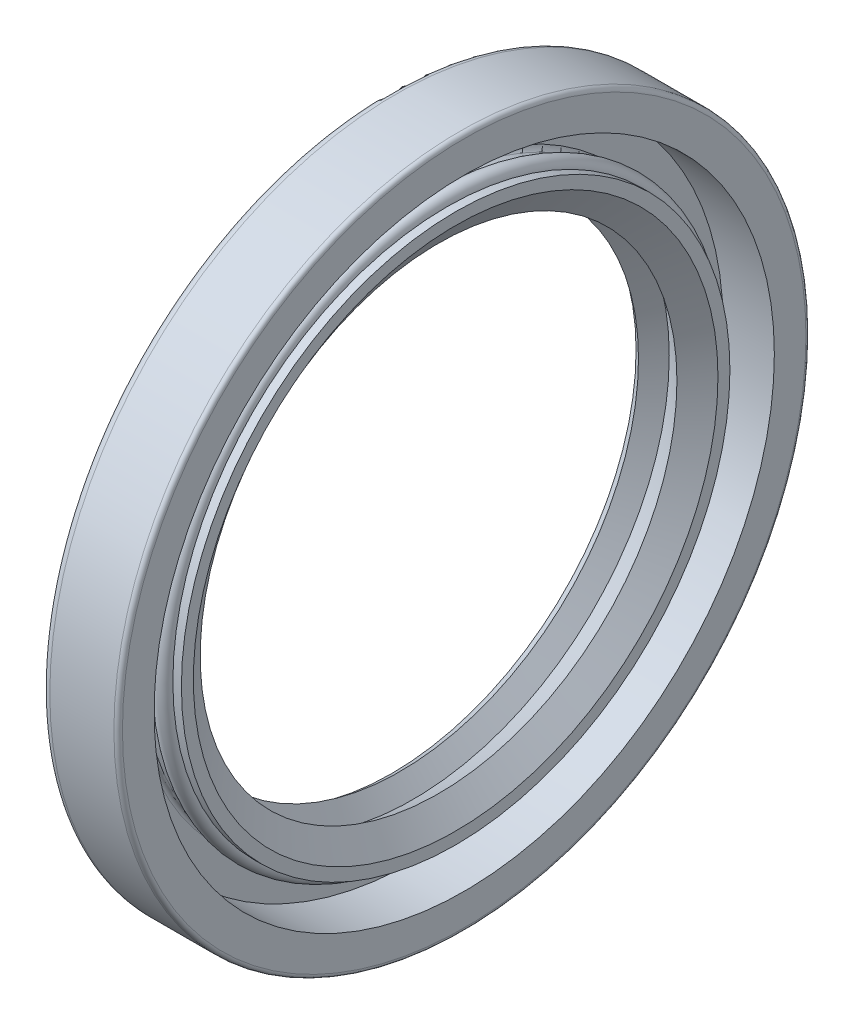
ISO-10303-21;
HEADER;
FILE_DESCRIPTION(('STEP AP214'),'2;1');
FILE_NAME('part.step','',(''),(''),'','','');
FILE_SCHEMA(('AUTOMOTIVE_DESIGN { 1 0 10303 214 1 1 1 1 }'));
ENDSEC;
DATA;
#1=APPLICATION_CONTEXT('core data for automotive mechanical design processes');
#2=APPLICATION_PROTOCOL_DEFINITION('international standard','automotive_design',2000,#1);
#3=PRODUCT_CONTEXT('',#1,'mechanical');
#4=PRODUCT('Part','Part','',(#3));
#5=PRODUCT_RELATED_PRODUCT_CATEGORY('part','',(#4));
#6=PRODUCT_DEFINITION_FORMATION('','',#4);
#7=PRODUCT_DEFINITION_CONTEXT('part definition',#1,'design');
#8=PRODUCT_DEFINITION('design','',#6,#7);
#9=PRODUCT_DEFINITION_SHAPE('','',#8);
#10=(LENGTH_UNIT() NAMED_UNIT(*) SI_UNIT(.MILLI.,.METRE.));
#11=(NAMED_UNIT(*) PLANE_ANGLE_UNIT() SI_UNIT($,.RADIAN.));
#12=(NAMED_UNIT(*) SI_UNIT($,.STERADIAN.) SOLID_ANGLE_UNIT());
#13=UNCERTAINTY_MEASURE_WITH_UNIT(LENGTH_MEASURE(1.E-05),#10,'distance_accuracy_value','');
#14=(GEOMETRIC_REPRESENTATION_CONTEXT(3) GLOBAL_UNCERTAINTY_ASSIGNED_CONTEXT((#13)) GLOBAL_UNIT_ASSIGNED_CONTEXT((#10,
#11,#12)) REPRESENTATION_CONTEXT('',''));
#15=CARTESIAN_POINT('',(0.,0.,0.));
#16=DIRECTION('',(0.,0.,1.));
#17=DIRECTION('',(1.,0.,0.));
#18=AXIS2_PLACEMENT_3D('',#15,#16,#17);
#19=CARTESIAN_POINT('',(0.,43.888888888889,0.));
#20=DIRECTION('',(-1.,0.,0.));
#21=DIRECTION('',(0.,0.,1.));
#22=AXIS2_PLACEMENT_3D('',#19,#20,#21);
#23=PLANE('',#22);
#24=CARTESIAN_POINT('',(0.,0.,0.));
#25=DIRECTION('',(1.,0.,0.));
#26=DIRECTION('',(0.,0.,-1.));
#27=AXIS2_PLACEMENT_3D('',#24,#25,#26);
#28=CIRCLE('',#27,40.333333333333);
#29=CARTESIAN_POINT('',(0.,0.,-40.333333333333));
#30=VERTEX_POINT('',#29);
#31=EDGE_CURVE('E119',#30,#30,#28,.T.);
#32=ORIENTED_EDGE('',*,*,#31,.T.);
#33=EDGE_LOOP('',(#32));
#34=FACE_BOUND('',#33,.T.);
#35=CARTESIAN_POINT('',(0.,0.,0.));
#36=DIRECTION('',(1.,0.,0.));
#37=DIRECTION('',(0.,0.,-1.));
#38=AXIS2_PLACEMENT_3D('',#35,#36,#37);
#39=CIRCLE('',#38,43.8888888888884);
#40=CARTESIAN_POINT('',(0.,0.,-43.8888888888884));
#41=VERTEX_POINT('',#40);
#42=EDGE_CURVE('E115',#41,#41,#39,.T.);
#43=ORIENTED_EDGE('',*,*,#42,.F.);
#44=EDGE_LOOP('',(#43));
#45=FACE_BOUND('',#44,.T.);
#46=ADVANCED_FACE('F24',(#34,#45),#23,.T.);
#47=CARTESIAN_POINT('',(10.,0.,0.));
#48=DIRECTION('',(1.,0.,0.));
#49=DIRECTION('',(0.,0.,-1.));
#50=AXIS2_PLACEMENT_3D('',#47,#48,#49);
#51=CYLINDRICAL_SURFACE('',#50,40.333333333333);
#52=CARTESIAN_POINT('',(0.199999999999999,0.,0.));
#53=DIRECTION('',(1.,0.,0.));
#54=DIRECTION('',(0.,0.,-1.));
#55=AXIS2_PLACEMENT_3D('',#52,#53,#54);
#56=CIRCLE('',#55,40.333333333333);
#57=CARTESIAN_POINT('',(0.199999999999999,0.,-40.333333333333));
#58=VERTEX_POINT('',#57);
#59=EDGE_CURVE('E111',#58,#58,#56,.T.);
#60=ORIENTED_EDGE('',*,*,#59,.T.);
#61=EDGE_LOOP('',(#60));
#62=FACE_BOUND('',#61,.T.);
#63=ORIENTED_EDGE('',*,*,#31,.F.);
#64=EDGE_LOOP('',(#63));
#65=FACE_BOUND('',#64,.T.);
#66=ADVANCED_FACE('F127',(#62,#65),#51,.F.);
#67=CARTESIAN_POINT('',(1.11111111111158,0.,0.));
#68=DIRECTION('',(1.,0.,0.));
#69=DIRECTION('',(0.,0.,-1.));
#70=AXIS2_PLACEMENT_3D('',#67,#68,#69);
#71=TOROIDAL_SURFACE('',#70,43.8888888888884,1.11111111111158);
#72=ORIENTED_EDGE('',*,*,#42,.T.);
#73=EDGE_LOOP('',(#72));
#74=FACE_BOUND('',#73,.T.);
#75=CARTESIAN_POINT('',(1.1111111111111,0.,0.));
#76=DIRECTION('',(1.,0.,0.));
#77=DIRECTION('',(0.,0.,-1.));
#78=AXIS2_PLACEMENT_3D('',#75,#76,#77);
#79=CIRCLE('',#78,45.);
#80=CARTESIAN_POINT('',(1.1111111111111,0.,-45.));
#81=VERTEX_POINT('',#80);
#82=EDGE_CURVE('E107',#81,#81,#79,.T.);
#83=ORIENTED_EDGE('',*,*,#82,.F.);
#84=EDGE_LOOP('',(#83));
#85=FACE_BOUND('',#84,.T.);
#86=ADVANCED_FACE('F129',(#74,#85),#71,.T.);
#87=CARTESIAN_POINT('',(0.2,40.333333333333,0.));
#88=DIRECTION('',(-1.,0.,0.));
#89=DIRECTION('',(0.,0.,1.));
#90=AXIS2_PLACEMENT_3D('',#87,#88,#89);
#91=PLANE('',#90);
#92=CARTESIAN_POINT('',(0.199999999999999,0.,0.));
#93=DIRECTION('',(1.,0.,0.));
#94=DIRECTION('',(0.,0.,-1.));
#95=AXIS2_PLACEMENT_3D('',#92,#93,#94);
#96=CIRCLE('',#95,35.666666666667);
#97=CARTESIAN_POINT('',(0.199999999999999,0.,-35.666666666667));
#98=VERTEX_POINT('',#97);
#99=EDGE_CURVE('E103',#98,#98,#96,.T.);
#100=ORIENTED_EDGE('',*,*,#99,.T.);
#101=EDGE_LOOP('',(#100));
#102=FACE_BOUND('',#101,.T.);
#103=ORIENTED_EDGE('',*,*,#59,.F.);
#104=EDGE_LOOP('',(#103));
#105=FACE_BOUND('',#104,.T.);
#106=ADVANCED_FACE('F137',(#102,#105),#91,.T.);
#107=CARTESIAN_POINT('',(10.,0.,0.));
#108=DIRECTION('',(1.,0.,0.));
#109=DIRECTION('',(0.,0.,-1.));
#110=AXIS2_PLACEMENT_3D('',#107,#108,#109);
#111=CYLINDRICAL_SURFACE('',#110,45.);
#112=ORIENTED_EDGE('',*,*,#82,.T.);
#113=EDGE_LOOP('',(#112));
#114=FACE_BOUND('',#113,.T.);
#115=CARTESIAN_POINT('',(9.4444444444444,0.,0.));
#116=DIRECTION('',(1.,0.,0.));
#117=DIRECTION('',(0.,0.,-1.));
#118=AXIS2_PLACEMENT_3D('',#115,#116,#117);
#119=CIRCLE('',#118,45.);
#120=CARTESIAN_POINT('',(9.4444444444444,0.,-45.));
#121=VERTEX_POINT('',#120);
#122=EDGE_CURVE('E99',#121,#121,#119,.T.);
#123=ORIENTED_EDGE('',*,*,#122,.F.);
#124=EDGE_LOOP('',(#123));
#125=FACE_BOUND('',#124,.T.);
#126=ADVANCED_FACE('F144',(#114,#125),#111,.T.);
#127=CARTESIAN_POINT('',(10.,0.,0.));
#128=DIRECTION('',(1.,0.,0.));
#129=DIRECTION('',(0.,0.,-1.));
#130=AXIS2_PLACEMENT_3D('',#127,#128,#129);
#131=CYLINDRICAL_SURFACE('',#130,35.666666666667);
#132=CARTESIAN_POINT('',(0.,0.,0.));
#133=DIRECTION('',(1.,0.,0.));
#134=DIRECTION('',(0.,0.,-1.));
#135=AXIS2_PLACEMENT_3D('',#132,#133,#134);
#136=CIRCLE('',#135,35.666666666667);
#137=CARTESIAN_POINT('',(0.,0.,-35.666666666667));
#138=VERTEX_POINT('',#137);
#139=EDGE_CURVE('E95',#138,#138,#136,.T.);
#140=ORIENTED_EDGE('',*,*,#139,.T.);
#141=EDGE_LOOP('',(#140));
#142=FACE_BOUND('',#141,.T.);
#143=ORIENTED_EDGE('',*,*,#99,.F.);
#144=EDGE_LOOP('',(#143));
#145=FACE_BOUND('',#144,.T.);
#146=ADVANCED_FACE('F148',(#142,#145),#131,.T.);
#147=CARTESIAN_POINT('',(9.444444444445,0.,0.));
#148=DIRECTION('',(1.,0.,0.));
#149=DIRECTION('',(0.,0.,-1.));
#150=AXIS2_PLACEMENT_3D('',#147,#148,#149);
#151=TOROIDAL_SURFACE('',#150,44.444444444445,0.555555555554997);
#152=ORIENTED_EDGE('',*,*,#122,.T.);
#153=EDGE_LOOP('',(#152));
#154=FACE_BOUND('',#153,.T.);
#155=CARTESIAN_POINT('',(10.,0.,0.));
#156=DIRECTION('',(1.,0.,0.));
#157=DIRECTION('',(0.,0.,-1.));
#158=AXIS2_PLACEMENT_3D('',#155,#156,#157);
#159=CIRCLE('',#158,44.444444444445);
#160=CARTESIAN_POINT('',(10.,0.,-44.444444444445));
#161=VERTEX_POINT('',#160);
#162=EDGE_CURVE('E91',#161,#161,#159,.T.);
#163=ORIENTED_EDGE('',*,*,#162,.F.);
#164=EDGE_LOOP('',(#163));
#165=FACE_BOUND('',#164,.T.);
#166=ADVANCED_FACE('F152',(#154,#165),#151,.T.);
#167=CARTESIAN_POINT('',(0.,35.666666666667,0.));
#168=DIRECTION('',(-1.,0.,0.));
#169=DIRECTION('',(0.,0.,1.));
#170=AXIS2_PLACEMENT_3D('',#167,#168,#169);
#171=PLANE('',#170);
#172=CARTESIAN_POINT('',(0.,0.,0.));
#173=DIRECTION('',(1.,0.,0.));
#174=DIRECTION('',(0.,0.,-1.));
#175=AXIS2_PLACEMENT_3D('',#172,#173,#174);
#176=CIRCLE('',#175,34.5);
#177=CARTESIAN_POINT('',(0.,0.,-34.5));
#178=VERTEX_POINT('',#177);
#179=EDGE_CURVE('E87',#178,#178,#176,.T.);
#180=ORIENTED_EDGE('',*,*,#179,.T.);
#181=EDGE_LOOP('',(#180));
#182=FACE_BOUND('',#181,.T.);
#183=ORIENTED_EDGE('',*,*,#139,.F.);
#184=EDGE_LOOP('',(#183));
#185=FACE_BOUND('',#184,.T.);
#186=ADVANCED_FACE('F156',(#182,#185),#171,.T.);
#187=CARTESIAN_POINT('',(10.,40.333333333333,0.));
#188=DIRECTION('',(1.,0.,0.));
#189=DIRECTION('',(0.,0.,-1.));
#190=AXIS2_PLACEMENT_3D('',#187,#188,#189);
#191=PLANE('',#190);
#192=ORIENTED_EDGE('',*,*,#162,.T.);
#193=EDGE_LOOP('',(#192));
#194=FACE_BOUND('',#193,.T.);
#195=CARTESIAN_POINT('',(10.,0.,0.));
#196=DIRECTION('',(1.,0.,0.));
#197=DIRECTION('',(0.,0.,-1.));
#198=AXIS2_PLACEMENT_3D('',#195,#196,#197);
#199=CIRCLE('',#198,40.333333333333);
#200=CARTESIAN_POINT('',(10.,0.,-40.333333333333));
#201=VERTEX_POINT('',#200);
#202=EDGE_CURVE('E83',#201,#201,#199,.T.);
#203=ORIENTED_EDGE('',*,*,#202,.F.);
#204=EDGE_LOOP('',(#203));
#205=FACE_BOUND('',#204,.T.);
#206=ADVANCED_FACE('F160',(#194,#205),#191,.T.);
#207=CARTESIAN_POINT('',(0.,0.,0.));
#208=DIRECTION('',(-1.,0.,0.));
#209=DIRECTION('',(0.,0.,1.));
#210=AXIS2_PLACEMENT_3D('',#207,#208,#209);
#211=CONICAL_SURFACE('',#210,34.5,0.610725964389335);
#212=CARTESIAN_POINT('',(1.6666666666667,0.,0.));
#213=DIRECTION('',(1.,0.,0.));
#214=DIRECTION('',(0.,0.,-1.));
#215=AXIS2_PLACEMENT_3D('',#212,#213,#214);
#216=CIRCLE('',#215,33.333333333333);
#217=CARTESIAN_POINT('',(1.6666666666667,0.,-33.333333333333));
#218=VERTEX_POINT('',#217);
#219=EDGE_CURVE('E79',#218,#218,#216,.T.);
#220=ORIENTED_EDGE('',*,*,#219,.T.);
#221=EDGE_LOOP('',(#220));
#222=FACE_BOUND('',#221,.T.);
#223=ORIENTED_EDGE('',*,*,#179,.F.);
#224=EDGE_LOOP('',(#223));
#225=FACE_BOUND('',#224,.T.);
#226=ADVANCED_FACE('F164',(#222,#225),#211,.F.);
#227=CARTESIAN_POINT('',(10.,0.,0.));
#228=DIRECTION('',(1.,0.,0.));
#229=DIRECTION('',(0.,0.,-1.));
#230=AXIS2_PLACEMENT_3D('',#227,#228,#229);
#231=CYLINDRICAL_SURFACE('',#230,40.333333333333);
#232=ORIENTED_EDGE('',*,*,#202,.T.);
#233=EDGE_LOOP('',(#232));
#234=FACE_BOUND('',#233,.T.);
#235=CARTESIAN_POINT('',(3.3333333333333,0.,0.));
#236=DIRECTION('',(1.,0.,0.));
#237=DIRECTION('',(0.,0.,-1.));
#238=AXIS2_PLACEMENT_3D('',#235,#236,#237);
#239=CIRCLE('',#238,40.333333333333);
#240=CARTESIAN_POINT('',(3.3333333333333,0.,-40.333333333333));
#241=VERTEX_POINT('',#240);
#242=EDGE_CURVE('E75',#241,#241,#239,.T.);
#243=ORIENTED_EDGE('',*,*,#242,.F.);
#244=EDGE_LOOP('',(#243));
#245=FACE_BOUND('',#244,.T.);
#246=ADVANCED_FACE('F168',(#234,#245),#231,.F.);
#247=CARTESIAN_POINT('',(1.6666666666667,0.,0.));
#248=DIRECTION('',(1.,0.,0.));
#249=DIRECTION('',(0.,0.,-1.));
#250=AXIS2_PLACEMENT_3D('',#247,#248,#249);
#251=CONICAL_SURFACE('',#250,33.333333333333,0.950546840812045);
#252=CARTESIAN_POINT('',(0.563063063063059,0.,0.));
#253=DIRECTION('',(1.,0.,0.));
#254=DIRECTION('',(0.,0.,-1.));
#255=AXIS2_PLACEMENT_3D('',#252,#253,#254);
#256=CIRCLE('',#255,31.788288288288);
#257=CARTESIAN_POINT('',(0.563063063063059,0.,-31.788288288288));
#258=VERTEX_POINT('',#257);
#259=EDGE_CURVE('E71',#258,#258,#256,.T.);
#260=ORIENTED_EDGE('',*,*,#259,.T.);
#261=EDGE_LOOP('',(#260));
#262=FACE_BOUND('',#261,.T.);
#263=ORIENTED_EDGE('',*,*,#219,.F.);
#264=EDGE_LOOP('',(#263));
#265=FACE_BOUND('',#264,.T.);
#266=ADVANCED_FACE('F172',(#262,#265),#251,.T.);
#267=CARTESIAN_POINT('',(3.3333333333333,36.222222166667,0.));
#268=DIRECTION('',(1.,0.,0.));
#269=DIRECTION('',(0.,0.,-1.));
#270=AXIS2_PLACEMENT_3D('',#267,#268,#269);
#271=PLANE('',#270);
#272=ORIENTED_EDGE('',*,*,#242,.T.);
#273=EDGE_LOOP('',(#272));
#274=FACE_BOUND('',#273,.T.);
#275=CARTESIAN_POINT('',(3.3333333333333,0.,0.));
#276=DIRECTION('',(1.,0.,0.));
#277=DIRECTION('',(0.,0.,-1.));
#278=AXIS2_PLACEMENT_3D('',#275,#276,#277);
#279=CIRCLE('',#278,36.2222222349319);
#280=CARTESIAN_POINT('',(3.3333333333333,0.,-36.2222222349319));
#281=VERTEX_POINT('',#280);
#282=EDGE_CURVE('E67',#281,#281,#279,.T.);
#283=ORIENTED_EDGE('',*,*,#282,.F.);
#284=EDGE_LOOP('',(#283));
#285=FACE_BOUND('',#284,.T.);
#286=ADVANCED_FACE('F176',(#274,#285),#271,.T.);
#287=CARTESIAN_POINT('',(0.563063063063059,0.,0.));
#288=DIRECTION('',(-1.,0.,0.));
#289=DIRECTION('',(0.,0.,1.));
#290=AXIS2_PLACEMENT_3D('',#287,#288,#289);
#291=CONICAL_SURFACE('',#290,31.788288288288,0.620249485982634);
#292=CARTESIAN_POINT('',(1.6666666666667,0.,0.));
#293=DIRECTION('',(1.,0.,0.));
#294=DIRECTION('',(0.,0.,-1.));
#295=AXIS2_PLACEMENT_3D('',#292,#293,#294);
#296=CIRCLE('',#295,31.);
#297=CARTESIAN_POINT('',(1.6666666666667,0.,-31.));
#298=VERTEX_POINT('',#297);
#299=EDGE_CURVE('E63',#298,#298,#296,.T.);
#300=ORIENTED_EDGE('',*,*,#299,.T.);
#301=EDGE_LOOP('',(#300));
#302=FACE_BOUND('',#301,.T.);
#303=ORIENTED_EDGE('',*,*,#259,.F.);
#304=EDGE_LOOP('',(#303));
#305=FACE_BOUND('',#304,.T.);
#306=ADVANCED_FACE('F180',(#302,#305),#291,.F.);
#307=CARTESIAN_POINT('',(3.88888883333256,0.,0.));
#308=DIRECTION('',(1.,0.,0.));
#309=DIRECTION('',(0.,0.,-1.));
#310=AXIS2_PLACEMENT_3D('',#307,#308,#309);
#311=TOROIDAL_SURFACE('',#310,36.2222221666662,0.555555499999264);
#312=CARTESIAN_POINT('',(3.8888888333333,0.,0.));
#313=DIRECTION('',(1.,0.,0.));
#314=DIRECTION('',(0.,0.,-1.));
#315=AXIS2_PLACEMENT_3D('',#312,#313,#314);
#316=CIRCLE('',#315,35.666666666667);
#317=CARTESIAN_POINT('',(3.8888888333333,0.,-35.666666666667));
#318=VERTEX_POINT('',#317);
#319=EDGE_CURVE('E59',#318,#318,#316,.T.);
#320=ORIENTED_EDGE('',*,*,#319,.F.);
#321=EDGE_LOOP('',(#320));
#322=FACE_BOUND('',#321,.T.);
#323=ORIENTED_EDGE('',*,*,#282,.T.);
#324=EDGE_LOOP('',(#323));
#325=FACE_BOUND('',#324,.T.);
#326=ADVANCED_FACE('F184',(#322,#325),#311,.F.);
#327=CARTESIAN_POINT('',(1.6666666666667,0.,0.));
#328=DIRECTION('',(1.,0.,0.));
#329=DIRECTION('',(0.,0.,-1.));
#330=AXIS2_PLACEMENT_3D('',#327,#328,#329);
#331=CONICAL_SURFACE('',#330,31.,0.950546840812026);
#332=CARTESIAN_POINT('',(3.3333333333333,0.,0.));
#333=DIRECTION('',(1.,0.,0.));
#334=DIRECTION('',(0.,0.,-1.));
#335=AXIS2_PLACEMENT_3D('',#332,#333,#334);
#336=CIRCLE('',#335,33.333333333333);
#337=CARTESIAN_POINT('',(3.3333333333333,0.,-33.333333333333));
#338=VERTEX_POINT('',#337);
#339=EDGE_CURVE('E55',#338,#338,#336,.T.);
#340=ORIENTED_EDGE('',*,*,#339,.T.);
#341=EDGE_LOOP('',(#340));
#342=FACE_BOUND('',#341,.T.);
#343=ORIENTED_EDGE('',*,*,#299,.F.);
#344=EDGE_LOOP('',(#343));
#345=FACE_BOUND('',#344,.T.);
#346=ADVANCED_FACE('F188',(#342,#345),#331,.F.);
#347=CARTESIAN_POINT('',(10.,0.,0.));
#348=DIRECTION('',(1.,0.,0.));
#349=DIRECTION('',(0.,0.,-1.));
#350=AXIS2_PLACEMENT_3D('',#347,#348,#349);
#351=CYLINDRICAL_SURFACE('',#350,35.666666666667);
#352=ORIENTED_EDGE('',*,*,#319,.T.);
#353=EDGE_LOOP('',(#352));
#354=FACE_BOUND('',#353,.T.);
#355=CARTESIAN_POINT('',(5.5555556666667,0.,0.));
#356=DIRECTION('',(1.,0.,0.));
#357=DIRECTION('',(0.,0.,-1.));
#358=AXIS2_PLACEMENT_3D('',#355,#356,#357);
#359=CIRCLE('',#358,35.666666666667);
#360=CARTESIAN_POINT('',(5.5555556666667,0.,-35.666666666667));
#361=VERTEX_POINT('',#360);
#362=EDGE_CURVE('E51',#361,#361,#359,.T.);
#363=ORIENTED_EDGE('',*,*,#362,.F.);
#364=EDGE_LOOP('',(#363));
#365=FACE_BOUND('',#364,.T.);
#366=ADVANCED_FACE('F192',(#354,#365),#351,.T.);
#367=CARTESIAN_POINT('',(3.3333333333333,0.,0.));
#368=DIRECTION('',(-1.,0.,0.));
#369=DIRECTION('',(0.,0.,1.));
#370=AXIS2_PLACEMENT_3D('',#367,#368,#369);
#371=CONICAL_SURFACE('',#370,33.333333333333,0.610725964389133);
#372=CARTESIAN_POINT('',(6.6666666666667,0.,0.));
#373=DIRECTION('',(1.,0.,0.));
#374=DIRECTION('',(0.,0.,-1.));
#375=AXIS2_PLACEMENT_3D('',#372,#373,#374);
#376=CIRCLE('',#375,31.);
#377=CARTESIAN_POINT('',(6.6666666666667,0.,-31.));
#378=VERTEX_POINT('',#377);
#379=EDGE_CURVE('E45',#378,#378,#376,.T.);
#380=ORIENTED_EDGE('',*,*,#379,.T.);
#381=EDGE_LOOP('',(#380));
#382=FACE_BOUND('',#381,.T.);
#383=ORIENTED_EDGE('',*,*,#339,.F.);
#384=EDGE_LOOP('',(#383));
#385=FACE_BOUND('',#384,.T.);
#386=ADVANCED_FACE('F196',(#382,#385),#371,.F.);
#387=CARTESIAN_POINT('',(6.6666666666667,0.,0.));
#388=DIRECTION('',(1.,0.,0.));
#389=DIRECTION('',(0.,0.,-1.));
#390=AXIS2_PLACEMENT_3D('',#387,#388,#389);
#391=TOROIDAL_SURFACE('',#390,35.666666666667,1.111111);
#392=ORIENTED_EDGE('',*,*,#362,.T.);
#393=EDGE_LOOP('',(#392));
#394=FACE_BOUND('',#393,.T.);
#395=CARTESIAN_POINT('',(7.7777776666667,0.,0.));
#396=DIRECTION('',(1.,0.,0.));
#397=DIRECTION('',(0.,0.,-1.));
#398=AXIS2_PLACEMENT_3D('',#395,#396,#397);
#399=CIRCLE('',#398,35.666666666667);
#400=CARTESIAN_POINT('',(7.7777776666667,0.,-35.666666666667));
#401=VERTEX_POINT('',#400);
#402=EDGE_CURVE('E39',#401,#401,#399,.T.);
#403=ORIENTED_EDGE('',*,*,#402,.F.);
#404=EDGE_LOOP('',(#403));
#405=FACE_BOUND('',#404,.T.);
#406=ADVANCED_FACE('F200',(#394,#405),#391,.T.);
#407=CARTESIAN_POINT('',(6.6666666666667,0.,0.));
#408=DIRECTION('',(1.,0.,0.));
#409=DIRECTION('',(0.,0.,-1.));
#410=AXIS2_PLACEMENT_3D('',#407,#408,#409);
#411=CONICAL_SURFACE('',#410,31.,0.950546840812039);
#412=CARTESIAN_POINT('',(8.8888888333333,0.,0.));
#413=DIRECTION('',(1.,0.,0.));
#414=DIRECTION('',(0.,0.,-1.));
#415=AXIS2_PLACEMENT_3D('',#412,#413,#414);
#416=CIRCLE('',#415,34.111111033333);
#417=CARTESIAN_POINT('',(8.8888888333333,0.,-34.111111033333));
#418=VERTEX_POINT('',#417);
#419=EDGE_CURVE('E32',#418,#418,#416,.T.);
#420=ORIENTED_EDGE('',*,*,#419,.T.);
#421=EDGE_LOOP('',(#420));
#422=FACE_BOUND('',#421,.T.);
#423=ORIENTED_EDGE('',*,*,#379,.F.);
#424=EDGE_LOOP('',(#423));
#425=FACE_BOUND('',#424,.T.);
#426=ADVANCED_FACE('F204',(#422,#425),#411,.F.);
#427=CARTESIAN_POINT('',(10.,0.,0.));
#428=DIRECTION('',(1.,0.,0.));
#429=DIRECTION('',(0.,0.,-1.));
#430=AXIS2_PLACEMENT_3D('',#427,#428,#429);
#431=CYLINDRICAL_SURFACE('',#430,35.666666666667);
#432=ORIENTED_EDGE('',*,*,#402,.T.);
#433=EDGE_LOOP('',(#432));
#434=FACE_BOUND('',#433,.T.);
#435=CARTESIAN_POINT('',(8.8888888333333,0.,0.));
#436=DIRECTION('',(1.,0.,0.));
#437=DIRECTION('',(0.,0.,-1.));
#438=AXIS2_PLACEMENT_3D('',#435,#436,#437);
#439=CIRCLE('',#438,35.666666666667);
#440=CARTESIAN_POINT('',(8.8888888333333,0.,-35.666666666667));
#441=VERTEX_POINT('',#440);
#442=EDGE_CURVE('E12',#441,#441,#439,.T.);
#443=ORIENTED_EDGE('',*,*,#442,.F.);
#444=EDGE_LOOP('',(#443));
#445=FACE_BOUND('',#444,.T.);
#446=ADVANCED_FACE('F207',(#434,#445),#431,.T.);
#447=CARTESIAN_POINT('',(8.8888888333333,34.111111033333,0.));
#448=DIRECTION('',(1.,0.,0.));
#449=DIRECTION('',(0.,0.,-1.));
#450=AXIS2_PLACEMENT_3D('',#447,#448,#449);
#451=PLANE('',#450);
#452=ORIENTED_EDGE('',*,*,#442,.T.);
#453=EDGE_LOOP('',(#452));
#454=FACE_BOUND('',#453,.T.);
#455=ORIENTED_EDGE('',*,*,#419,.F.);
#456=EDGE_LOOP('',(#455));
#457=FACE_BOUND('',#456,.T.);
#458=ADVANCED_FACE('F26',(#454,#457),#451,.T.);
#459=CLOSED_SHELL('',(#46,#66,#86,#106,#126,#146,#166,#186,#206,#226,#246,#266,#286,#306,#326,
#346,#366,#386,#406,#426,#446,#458));
#460=MANIFOLD_SOLID_BREP('B1',#459);
#461=ADVANCED_BREP_SHAPE_REPRESENTATION('',(#18,#460),#14);
#462=SHAPE_DEFINITION_REPRESENTATION(#9,#461);
ENDSEC;
END-ISO-10303-21;
